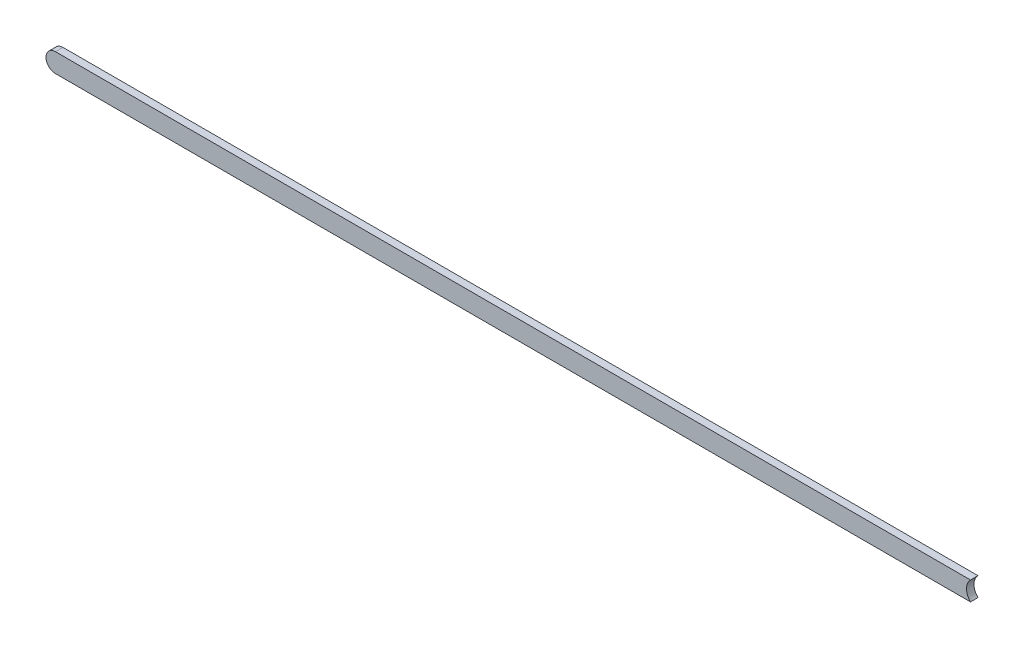
ISO-10303-21;
HEADER;
FILE_DESCRIPTION(('STEP AP214'),'2;1');
FILE_NAME('part.step','',(''),(''),'','','');
FILE_SCHEMA(('AUTOMOTIVE_DESIGN { 1 0 10303 214 1 1 1 1 }'));
ENDSEC;
DATA;
#1=APPLICATION_CONTEXT('core data for automotive mechanical design processes');
#2=APPLICATION_PROTOCOL_DEFINITION('international standard','automotive_design',2000,#1);
#3=PRODUCT_CONTEXT('',#1,'mechanical');
#4=PRODUCT('Part','Part','',(#3));
#5=PRODUCT_RELATED_PRODUCT_CATEGORY('part','',(#4));
#6=PRODUCT_DEFINITION_FORMATION('','',#4);
#7=PRODUCT_DEFINITION_CONTEXT('part definition',#1,'design');
#8=PRODUCT_DEFINITION('design','',#6,#7);
#9=PRODUCT_DEFINITION_SHAPE('','',#8);
#10=(LENGTH_UNIT() NAMED_UNIT(*) SI_UNIT(.MILLI.,.METRE.));
#11=(NAMED_UNIT(*) PLANE_ANGLE_UNIT() SI_UNIT($,.RADIAN.));
#12=(NAMED_UNIT(*) SI_UNIT($,.STERADIAN.) SOLID_ANGLE_UNIT());
#13=UNCERTAINTY_MEASURE_WITH_UNIT(LENGTH_MEASURE(1.E-05),#10,'distance_accuracy_value','');
#14=(GEOMETRIC_REPRESENTATION_CONTEXT(3) GLOBAL_UNCERTAINTY_ASSIGNED_CONTEXT((#13)) GLOBAL_UNIT_ASSIGNED_CONTEXT((#10,
#11,#12)) REPRESENTATION_CONTEXT('',''));
#15=CARTESIAN_POINT('',(0.,0.,0.));
#16=DIRECTION('',(0.,0.,1.));
#17=DIRECTION('',(1.,0.,0.));
#18=AXIS2_PLACEMENT_3D('',#15,#16,#17);
#19=CARTESIAN_POINT('',(111.4298,68.834,0.));
#20=DIRECTION('',(0.,1.,0.));
#21=DIRECTION('',(1.,0.,0.));
#22=AXIS2_PLACEMENT_3D('',#19,#20,#21);
#23=PLANE('',#22);
#24=DIRECTION('',(1.,0.,0.));
#25=VECTOR('',#24,1.);
#26=CARTESIAN_POINT('',(111.4298,68.834,0.1999996));
#27=LINE('',#26,#25);
#28=CARTESIAN_POINT('',(111.4298,68.834,0.1999996));
#29=VERTEX_POINT('',#28);
#30=CARTESIAN_POINT('',(135.895131842133,68.834,0.1999996));
#31=VERTEX_POINT('',#30);
#32=EDGE_CURVE('E11',#29,#31,#27,.T.);
#33=ORIENTED_EDGE('',*,*,#32,.F.);
#34=DIRECTION('',(0.,0.,1.));
#35=VECTOR('',#34,1.);
#36=CARTESIAN_POINT('',(111.4298,68.834,0.));
#37=LINE('',#36,#35);
#38=CARTESIAN_POINT('',(111.4298,68.834,0.));
#39=VERTEX_POINT('',#38);
#40=EDGE_CURVE('E24',#39,#29,#37,.T.);
#41=ORIENTED_EDGE('',*,*,#40,.F.);
#42=DIRECTION('',(1.,0.,0.));
#43=VECTOR('',#42,1.);
#44=CARTESIAN_POINT('',(111.4298,68.834,0.));
#45=LINE('',#44,#43);
#46=CARTESIAN_POINT('',(135.895131842133,68.834,0.));
#47=VERTEX_POINT('',#46);
#48=EDGE_CURVE('E75',#39,#47,#45,.T.);
#49=ORIENTED_EDGE('',*,*,#48,.T.);
#50=DIRECTION('',(0.,0.,1.));
#51=VECTOR('',#50,1.);
#52=CARTESIAN_POINT('',(135.895131842133,68.834,0.));
#53=LINE('',#52,#51);
#54=EDGE_CURVE('E37',#47,#31,#53,.T.);
#55=ORIENTED_EDGE('',*,*,#54,.T.);
#56=EDGE_LOOP('',(#33,#41,#49,#55));
#57=FACE_BOUND('',#56,.T.);
#58=ADVANCED_FACE('F17',(#57),#23,.F.);
#59=CARTESIAN_POINT('',(136.144,69.088,0.));
#60=DIRECTION('',(0.,0.,-1.));
#61=DIRECTION('',(1.,0.,0.));
#62=AXIS2_PLACEMENT_3D('',#59,#60,#61);
#63=CYLINDRICAL_SURFACE('',#62,0.3556);
#64=DIRECTION('',(0.,0.,1.));
#65=VECTOR('',#64,1.);
#66=CARTESIAN_POINT('',(135.895131842133,69.342,0.));
#67=LINE('',#66,#65);
#68=CARTESIAN_POINT('',(135.895131842133,69.342,0.));
#69=VERTEX_POINT('',#68);
#70=CARTESIAN_POINT('',(135.895131842133,69.342,0.1999996));
#71=VERTEX_POINT('',#70);
#72=EDGE_CURVE('E67',#69,#71,#67,.T.);
#73=ORIENTED_EDGE('',*,*,#72,.T.);
#74=CARTESIAN_POINT('',(136.144,69.088,0.1999996));
#75=DIRECTION('',(0.,0.,1.));
#76=DIRECTION('',(1.,0.,0.));
#77=AXIS2_PLACEMENT_3D('',#74,#75,#76);
#78=CIRCLE('',#77,0.3556);
#79=EDGE_CURVE('E82',#71,#31,#78,.T.);
#80=ORIENTED_EDGE('',*,*,#79,.T.);
#81=ORIENTED_EDGE('',*,*,#54,.F.);
#82=CARTESIAN_POINT('',(136.144,69.088,0.));
#83=DIRECTION('',(0.,0.,1.));
#84=DIRECTION('',(1.,0.,0.));
#85=AXIS2_PLACEMENT_3D('',#82,#83,#84);
#86=CIRCLE('',#85,0.3556);
#87=EDGE_CURVE('E80',#69,#47,#86,.T.);
#88=ORIENTED_EDGE('',*,*,#87,.F.);
#89=EDGE_LOOP('',(#73,#80,#81,#88));
#90=FACE_BOUND('',#89,.T.);
#91=ADVANCED_FACE('F88',(#90),#63,.F.);
#92=CARTESIAN_POINT('',(135.895131842133,69.342,0.));
#93=DIRECTION('',(0.,-1.,0.));
#94=DIRECTION('',(-1.,0.,0.));
#95=AXIS2_PLACEMENT_3D('',#92,#93,#94);
#96=PLANE('',#95);
#97=DIRECTION('',(-1.,0.,0.));
#98=VECTOR('',#97,1.);
#99=CARTESIAN_POINT('',(136.144,69.342,0.1999996));
#100=LINE('',#99,#98);
#101=CARTESIAN_POINT('',(111.4298,69.342,0.1999996));
#102=VERTEX_POINT('',#101);
#103=EDGE_CURVE('E71',#71,#102,#100,.T.);
#104=ORIENTED_EDGE('',*,*,#103,.F.);
#105=ORIENTED_EDGE('',*,*,#72,.F.);
#106=DIRECTION('',(-1.,0.,0.));
#107=VECTOR('',#106,1.);
#108=CARTESIAN_POINT('',(136.144,69.342,0.));
#109=LINE('',#108,#107);
#110=CARTESIAN_POINT('',(111.4298,69.342,0.));
#111=VERTEX_POINT('',#110);
#112=EDGE_CURVE('E63',#69,#111,#109,.T.);
#113=ORIENTED_EDGE('',*,*,#112,.T.);
#114=DIRECTION('',(0.,0.,1.));
#115=VECTOR('',#114,1.);
#116=CARTESIAN_POINT('',(111.4298,69.342,0.));
#117=LINE('',#116,#115);
#118=EDGE_CURVE('E53',#111,#102,#117,.T.);
#119=ORIENTED_EDGE('',*,*,#118,.T.);
#120=EDGE_LOOP('',(#104,#105,#113,#119));
#121=FACE_BOUND('',#120,.T.);
#122=ADVANCED_FACE('F66',(#121),#96,.F.);
#123=CARTESIAN_POINT('',(111.4298,69.088,0.));
#124=DIRECTION('',(0.,0.,-1.));
#125=DIRECTION('',(0.,1.,0.));
#126=AXIS2_PLACEMENT_3D('',#123,#124,#125);
#127=CYLINDRICAL_SURFACE('',#126,0.253999999999995);
#128=CARTESIAN_POINT('',(111.4298,69.088,0.1999996));
#129=DIRECTION('',(0.,0.,1.));
#130=DIRECTION('',(0.,1.,0.));
#131=AXIS2_PLACEMENT_3D('',#128,#129,#130);
#132=CIRCLE('',#131,0.253999999999995);
#133=EDGE_CURVE('E59',#102,#29,#132,.T.);
#134=ORIENTED_EDGE('',*,*,#133,.F.);
#135=ORIENTED_EDGE('',*,*,#118,.F.);
#136=CARTESIAN_POINT('',(111.4298,69.088,0.));
#137=DIRECTION('',(0.,0.,1.));
#138=DIRECTION('',(0.,1.,0.));
#139=AXIS2_PLACEMENT_3D('',#136,#137,#138);
#140=CIRCLE('',#139,0.253999999999995);
#141=EDGE_CURVE('E57',#111,#39,#140,.T.);
#142=ORIENTED_EDGE('',*,*,#141,.T.);
#143=ORIENTED_EDGE('',*,*,#40,.T.);
#144=EDGE_LOOP('',(#134,#135,#142,#143));
#145=FACE_BOUND('',#144,.T.);
#146=ADVANCED_FACE('F55',(#145),#127,.T.);
#147=CARTESIAN_POINT('',(111.4298,68.834,0.));
#148=DIRECTION('',(0.,0.,-1.));
#149=DIRECTION('',(-1.,0.,0.));
#150=AXIS2_PLACEMENT_3D('',#147,#148,#149);
#151=PLANE('',#150);
#152=ORIENTED_EDGE('',*,*,#48,.F.);
#153=ORIENTED_EDGE('',*,*,#141,.F.);
#154=ORIENTED_EDGE('',*,*,#112,.F.);
#155=ORIENTED_EDGE('',*,*,#87,.T.);
#156=EDGE_LOOP('',(#152,#153,#154,#155));
#157=FACE_BOUND('',#156,.T.);
#158=ADVANCED_FACE('F74',(#157),#151,.T.);
#159=CARTESIAN_POINT('',(111.4298,68.834,0.1999996));
#160=DIRECTION('',(0.,0.,-1.));
#161=DIRECTION('',(-1.,0.,0.));
#162=AXIS2_PLACEMENT_3D('',#159,#160,#161);
#163=PLANE('',#162);
#164=ORIENTED_EDGE('',*,*,#133,.T.);
#165=ORIENTED_EDGE('',*,*,#32,.T.);
#166=ORIENTED_EDGE('',*,*,#79,.F.);
#167=ORIENTED_EDGE('',*,*,#103,.T.);
#168=EDGE_LOOP('',(#164,#165,#166,#167));
#169=FACE_BOUND('',#168,.T.);
#170=ADVANCED_FACE('F91',(#169),#163,.F.);
#171=CLOSED_SHELL('',(#58,#91,#122,#146,#158,#170));
#172=MANIFOLD_SOLID_BREP('B1',#171);
#173=ADVANCED_BREP_SHAPE_REPRESENTATION('',(#18,#172),#14);
#174=SHAPE_DEFINITION_REPRESENTATION(#9,#173);
ENDSEC;
END-ISO-10303-21;
